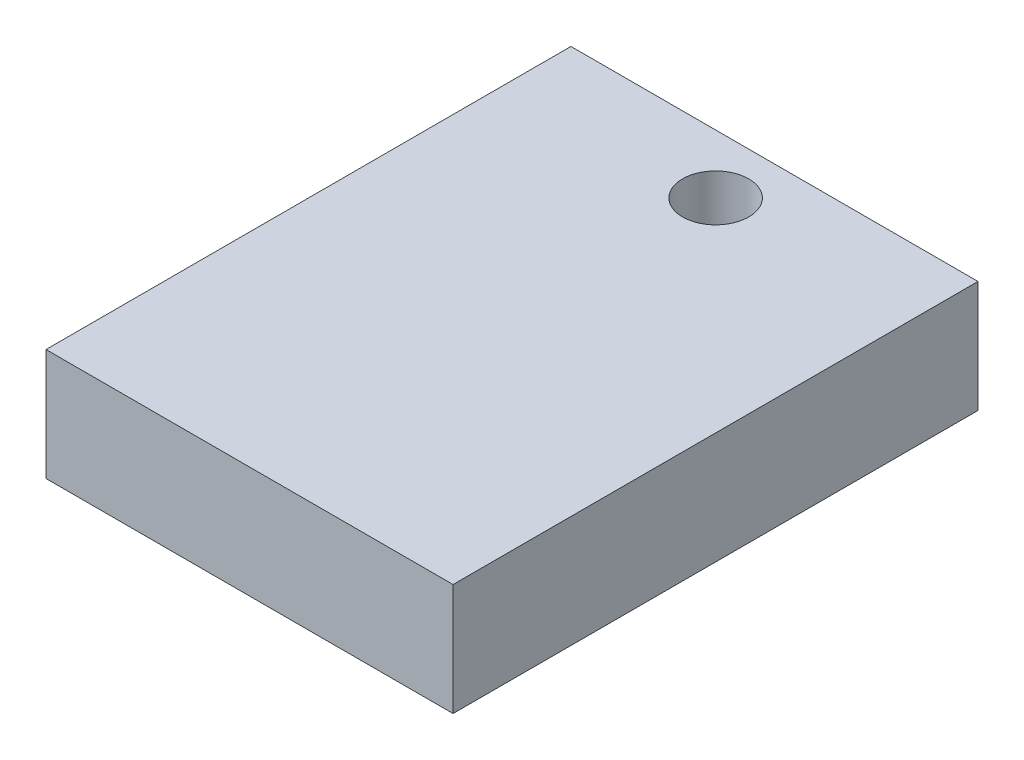
ISO-10303-21;
HEADER;
FILE_DESCRIPTION(('STEP AP214'),'2;1');
FILE_NAME('part.step','',(''),(''),'','','');
FILE_SCHEMA(('AUTOMOTIVE_DESIGN { 1 0 10303 214 1 1 1 1 }'));
ENDSEC;
DATA;
#1=APPLICATION_CONTEXT('core data for automotive mechanical design processes');
#2=APPLICATION_PROTOCOL_DEFINITION('international standard','automotive_design',2000,#1);
#3=PRODUCT_CONTEXT('',#1,'mechanical');
#4=PRODUCT('Part','Part','',(#3));
#5=PRODUCT_RELATED_PRODUCT_CATEGORY('part','',(#4));
#6=PRODUCT_DEFINITION_FORMATION('','',#4);
#7=PRODUCT_DEFINITION_CONTEXT('part definition',#1,'design');
#8=PRODUCT_DEFINITION('design','',#6,#7);
#9=PRODUCT_DEFINITION_SHAPE('','',#8);
#10=(LENGTH_UNIT() NAMED_UNIT(*) SI_UNIT(.MILLI.,.METRE.));
#11=(NAMED_UNIT(*) PLANE_ANGLE_UNIT() SI_UNIT($,.RADIAN.));
#12=(NAMED_UNIT(*) SI_UNIT($,.STERADIAN.) SOLID_ANGLE_UNIT());
#13=UNCERTAINTY_MEASURE_WITH_UNIT(LENGTH_MEASURE(1.E-05),#10,'distance_accuracy_value','');
#14=(GEOMETRIC_REPRESENTATION_CONTEXT(3) GLOBAL_UNCERTAINTY_ASSIGNED_CONTEXT((#13)) GLOBAL_UNIT_ASSIGNED_CONTEXT((#10,
#11,#12)) REPRESENTATION_CONTEXT('',''));
#15=CARTESIAN_POINT('',(0.,0.,0.));
#16=DIRECTION('',(0.,0.,1.));
#17=DIRECTION('',(1.,0.,0.));
#18=AXIS2_PLACEMENT_3D('',#15,#16,#17);
#19=CARTESIAN_POINT('',(0.,12.065,0.));
#20=DIRECTION('',(0.,1.,0.));
#21=DIRECTION('',(0.,0.,1.));
#22=AXIS2_PLACEMENT_3D('',#19,#20,#21);
#23=PLANE('',#22);
#24=DIRECTION('',(0.,0.,1.));
#25=VECTOR('',#24,1.);
#26=CARTESIAN_POINT('',(0.,12.065,0.));
#27=LINE('',#26,#25);
#28=CARTESIAN_POINT('',(0.,12.065,0.));
#29=VERTEX_POINT('',#28);
#30=CARTESIAN_POINT('',(0.,12.065,56.6674));
#31=VERTEX_POINT('',#30);
#32=EDGE_CURVE('E93',#29,#31,#27,.T.);
#33=ORIENTED_EDGE('',*,*,#32,.T.);
#34=DIRECTION('',(1.,0.,0.));
#35=VECTOR('',#34,1.);
#36=CARTESIAN_POINT('',(0.,12.065,56.6674));
#37=LINE('',#36,#35);
#38=CARTESIAN_POINT('',(43.942,12.065,56.6674));
#39=VERTEX_POINT('',#38);
#40=EDGE_CURVE('E88',#31,#39,#37,.T.);
#41=ORIENTED_EDGE('',*,*,#40,.T.);
#42=DIRECTION('',(0.,0.,-1.));
#43=VECTOR('',#42,1.);
#44=CARTESIAN_POINT('',(43.942,12.065,0.));
#45=LINE('',#44,#43);
#46=CARTESIAN_POINT('',(43.942,12.065,0.));
#47=VERTEX_POINT('',#46);
#48=EDGE_CURVE('E91',#39,#47,#45,.T.);
#49=ORIENTED_EDGE('',*,*,#48,.T.);
#50=DIRECTION('',(-1.,0.,0.));
#51=VECTOR('',#50,1.);
#52=CARTESIAN_POINT('',(0.,12.065,0.));
#53=LINE('',#52,#51);
#54=EDGE_CURVE('E58',#47,#29,#53,.T.);
#55=ORIENTED_EDGE('',*,*,#54,.T.);
#56=EDGE_LOOP('',(#33,#41,#49,#55));
#57=FACE_BOUND('',#56,.T.);
#58=CARTESIAN_POINT('',(21.971,12.065,6.35));
#59=DIRECTION('',(0.,1.,0.));
#60=DIRECTION('',(0.,0.,1.));
#61=AXIS2_PLACEMENT_3D('',#58,#59,#60);
#62=CIRCLE('',#61,3.57);
#63=CARTESIAN_POINT('',(21.971,12.065,2.78));
#64=VERTEX_POINT('',#63);
#65=EDGE_CURVE('E108',#64,#64,#62,.T.);
#66=ORIENTED_EDGE('',*,*,#65,.F.);
#67=EDGE_LOOP('',(#66));
#68=FACE_BOUND('',#67,.T.);
#69=ADVANCED_FACE('F41',(#57,#68),#23,.T.);
#70=CARTESIAN_POINT('',(0.,0.,0.));
#71=DIRECTION('',(0.,1.,0.));
#72=DIRECTION('',(0.,0.,1.));
#73=AXIS2_PLACEMENT_3D('',#70,#71,#72);
#74=PLANE('',#73);
#75=DIRECTION('',(0.,0.,1.));
#76=VECTOR('',#75,1.);
#77=CARTESIAN_POINT('',(0.,0.,0.));
#78=LINE('',#77,#76);
#79=CARTESIAN_POINT('',(0.,0.,0.));
#80=VERTEX_POINT('',#79);
#81=CARTESIAN_POINT('',(0.,0.,56.6674));
#82=VERTEX_POINT('',#81);
#83=EDGE_CURVE('E105',#80,#82,#78,.T.);
#84=ORIENTED_EDGE('',*,*,#83,.F.);
#85=DIRECTION('',(-1.,0.,0.));
#86=VECTOR('',#85,1.);
#87=CARTESIAN_POINT('',(0.,0.,0.));
#88=LINE('',#87,#86);
#89=CARTESIAN_POINT('',(43.942,0.,0.));
#90=VERTEX_POINT('',#89);
#91=EDGE_CURVE('E81',#90,#80,#88,.T.);
#92=ORIENTED_EDGE('',*,*,#91,.F.);
#93=DIRECTION('',(0.,0.,-1.));
#94=VECTOR('',#93,1.);
#95=CARTESIAN_POINT('',(43.942,0.,0.));
#96=LINE('',#95,#94);
#97=CARTESIAN_POINT('',(43.942,0.,56.6674));
#98=VERTEX_POINT('',#97);
#99=EDGE_CURVE('E75',#98,#90,#96,.T.);
#100=ORIENTED_EDGE('',*,*,#99,.F.);
#101=DIRECTION('',(1.,0.,0.));
#102=VECTOR('',#101,1.);
#103=CARTESIAN_POINT('',(0.,0.,56.6674));
#104=LINE('',#103,#102);
#105=EDGE_CURVE('E97',#82,#98,#104,.T.);
#106=ORIENTED_EDGE('',*,*,#105,.F.);
#107=EDGE_LOOP('',(#84,#92,#100,#106));
#108=FACE_BOUND('',#107,.T.);
#109=CARTESIAN_POINT('',(21.971,0.,6.35));
#110=DIRECTION('',(0.,1.,0.));
#111=DIRECTION('',(0.,0.,1.));
#112=AXIS2_PLACEMENT_3D('',#109,#110,#111);
#113=CIRCLE('',#112,3.57);
#114=CARTESIAN_POINT('',(21.971,0.,2.78));
#115=VERTEX_POINT('',#114);
#116=EDGE_CURVE('E120',#115,#115,#113,.T.);
#117=ORIENTED_EDGE('',*,*,#116,.T.);
#118=EDGE_LOOP('',(#117));
#119=FACE_BOUND('',#118,.T.);
#120=ADVANCED_FACE('F116',(#108,#119),#74,.F.);
#121=CARTESIAN_POINT('',(0.,12.065,0.));
#122=DIRECTION('',(1.,0.,0.));
#123=DIRECTION('',(0.,0.,-1.));
#124=AXIS2_PLACEMENT_3D('',#121,#122,#123);
#125=PLANE('',#124);
#126=ORIENTED_EDGE('',*,*,#83,.T.);
#127=DIRECTION('',(0.,-1.,0.));
#128=VECTOR('',#127,1.);
#129=CARTESIAN_POINT('',(0.,12.065,56.6674));
#130=LINE('',#129,#128);
#131=EDGE_CURVE('E11',#31,#82,#130,.T.);
#132=ORIENTED_EDGE('',*,*,#131,.F.);
#133=ORIENTED_EDGE('',*,*,#32,.F.);
#134=DIRECTION('',(0.,-1.,0.));
#135=VECTOR('',#134,1.);
#136=CARTESIAN_POINT('',(0.,12.065,0.));
#137=LINE('',#136,#135);
#138=EDGE_CURVE('E101',#29,#80,#137,.T.);
#139=ORIENTED_EDGE('',*,*,#138,.T.);
#140=EDGE_LOOP('',(#126,#132,#133,#139));
#141=FACE_BOUND('',#140,.T.);
#142=ADVANCED_FACE('F43',(#141),#125,.F.);
#143=CARTESIAN_POINT('',(0.,12.065,56.6674));
#144=DIRECTION('',(0.,0.,-1.));
#145=DIRECTION('',(-1.,0.,0.));
#146=AXIS2_PLACEMENT_3D('',#143,#144,#145);
#147=PLANE('',#146);
#148=ORIENTED_EDGE('',*,*,#105,.T.);
#149=DIRECTION('',(0.,-1.,0.));
#150=VECTOR('',#149,1.);
#151=CARTESIAN_POINT('',(43.942,12.065,56.6674));
#152=LINE('',#151,#150);
#153=EDGE_CURVE('E50',#39,#98,#152,.T.);
#154=ORIENTED_EDGE('',*,*,#153,.F.);
#155=ORIENTED_EDGE('',*,*,#40,.F.);
#156=ORIENTED_EDGE('',*,*,#131,.T.);
#157=EDGE_LOOP('',(#148,#154,#155,#156));
#158=FACE_BOUND('',#157,.T.);
#159=ADVANCED_FACE('F96',(#158),#147,.F.);
#160=CARTESIAN_POINT('',(43.942,12.065,0.));
#161=DIRECTION('',(-1.,0.,0.));
#162=DIRECTION('',(0.,0.,1.));
#163=AXIS2_PLACEMENT_3D('',#160,#161,#162);
#164=PLANE('',#163);
#165=ORIENTED_EDGE('',*,*,#99,.T.);
#166=DIRECTION('',(0.,-1.,0.));
#167=VECTOR('',#166,1.);
#168=CARTESIAN_POINT('',(43.942,12.065,0.));
#169=LINE('',#168,#167);
#170=EDGE_CURVE('E98',#47,#90,#169,.T.);
#171=ORIENTED_EDGE('',*,*,#170,.F.);
#172=ORIENTED_EDGE('',*,*,#48,.F.);
#173=ORIENTED_EDGE('',*,*,#153,.T.);
#174=EDGE_LOOP('',(#165,#171,#172,#173));
#175=FACE_BOUND('',#174,.T.);
#176=ADVANCED_FACE('F99',(#175),#164,.F.);
#177=CARTESIAN_POINT('',(0.,12.065,0.));
#178=DIRECTION('',(0.,0.,1.));
#179=DIRECTION('',(1.,0.,0.));
#180=AXIS2_PLACEMENT_3D('',#177,#178,#179);
#181=PLANE('',#180);
#182=ORIENTED_EDGE('',*,*,#91,.T.);
#183=ORIENTED_EDGE('',*,*,#138,.F.);
#184=ORIENTED_EDGE('',*,*,#54,.F.);
#185=ORIENTED_EDGE('',*,*,#170,.T.);
#186=EDGE_LOOP('',(#182,#183,#184,#185));
#187=FACE_BOUND('',#186,.T.);
#188=ADVANCED_FACE('F113',(#187),#181,.F.);
#189=CARTESIAN_POINT('',(21.971,12.065,6.35));
#190=DIRECTION('',(0.,-1.,0.));
#191=DIRECTION('',(0.,0.,-1.));
#192=AXIS2_PLACEMENT_3D('',#189,#190,#191);
#193=CYLINDRICAL_SURFACE('',#192,3.57);
#194=CARTESIAN_POINT('',(21.971,12.065,2.78));
#195=CARTESIAN_POINT('',(21.971,11.9393229166667,2.78));
#196=CARTESIAN_POINT('',(21.971,11.8136458333333,2.78));
#197=CARTESIAN_POINT('',(21.971,11.5622916666667,2.78));
#198=CARTESIAN_POINT('',(21.971,11.4366145833333,2.78));
#199=CARTESIAN_POINT('',(21.971,11.1852604166667,2.78));
#200=CARTESIAN_POINT('',(21.971,11.0595833333333,2.78));
#201=CARTESIAN_POINT('',(21.971,10.8082291666667,2.78));
#202=CARTESIAN_POINT('',(21.971,10.6825520833333,2.78));
#203=CARTESIAN_POINT('',(21.971,10.4311979166667,2.78));
#204=CARTESIAN_POINT('',(21.971,10.3055208333333,2.78));
#205=CARTESIAN_POINT('',(21.971,10.0541666666667,2.78));
#206=CARTESIAN_POINT('',(21.971,9.92848958333333,2.78));
#207=CARTESIAN_POINT('',(21.971,9.67713541666667,2.78));
#208=CARTESIAN_POINT('',(21.971,9.55145833333333,2.78));
#209=CARTESIAN_POINT('',(21.971,9.30010416666667,2.78));
#210=CARTESIAN_POINT('',(21.971,9.17442708333333,2.78));
#211=CARTESIAN_POINT('',(21.971,8.92307291666667,2.78));
#212=CARTESIAN_POINT('',(21.971,8.79739583333333,2.78));
#213=CARTESIAN_POINT('',(21.971,8.54604166666667,2.78));
#214=CARTESIAN_POINT('',(21.971,8.42036458333333,2.78));
#215=CARTESIAN_POINT('',(21.971,8.16901041666667,2.78));
#216=CARTESIAN_POINT('',(21.971,8.04333333333333,2.78));
#217=CARTESIAN_POINT('',(21.971,7.79197916666666,2.78));
#218=CARTESIAN_POINT('',(21.971,7.66630208333333,2.78));
#219=CARTESIAN_POINT('',(21.971,7.41494791666666,2.78));
#220=CARTESIAN_POINT('',(21.971,7.28927083333333,2.78));
#221=CARTESIAN_POINT('',(21.971,7.03791666666667,2.78));
#222=CARTESIAN_POINT('',(21.971,6.91223958333333,2.78));
#223=CARTESIAN_POINT('',(21.971,6.66088541666667,2.78));
#224=CARTESIAN_POINT('',(21.971,6.53520833333333,2.78));
#225=CARTESIAN_POINT('',(21.971,6.28385416666667,2.78));
#226=CARTESIAN_POINT('',(21.971,6.15817708333333,2.78));
#227=CARTESIAN_POINT('',(21.971,5.90682291666667,2.78));
#228=CARTESIAN_POINT('',(21.971,5.78114583333333,2.78));
#229=CARTESIAN_POINT('',(21.971,5.52979166666667,2.78));
#230=CARTESIAN_POINT('',(21.971,5.40411458333333,2.78));
#231=CARTESIAN_POINT('',(21.971,5.15276041666666,2.78));
#232=CARTESIAN_POINT('',(21.971,5.02708333333333,2.78));
#233=CARTESIAN_POINT('',(21.971,4.77572916666667,2.78));
#234=CARTESIAN_POINT('',(21.971,4.65005208333333,2.78));
#235=CARTESIAN_POINT('',(21.971,4.39869791666667,2.78));
#236=CARTESIAN_POINT('',(21.971,4.27302083333333,2.78));
#237=CARTESIAN_POINT('',(21.971,4.02166666666667,2.78));
#238=CARTESIAN_POINT('',(21.971,3.89598958333333,2.78));
#239=CARTESIAN_POINT('',(21.971,3.64463541666667,2.78));
#240=CARTESIAN_POINT('',(21.971,3.51895833333333,2.78));
#241=CARTESIAN_POINT('',(21.971,3.26760416666666,2.78));
#242=CARTESIAN_POINT('',(21.971,3.14192708333333,2.78));
#243=CARTESIAN_POINT('',(21.971,2.89057291666666,2.78));
#244=CARTESIAN_POINT('',(21.971,2.76489583333333,2.78));
#245=CARTESIAN_POINT('',(21.971,2.51354166666667,2.78));
#246=CARTESIAN_POINT('',(21.971,2.38786458333333,2.78));
#247=CARTESIAN_POINT('',(21.971,2.13651041666667,2.78));
#248=CARTESIAN_POINT('',(21.971,2.01083333333333,2.78));
#249=CARTESIAN_POINT('',(21.971,1.75947916666667,2.78));
#250=CARTESIAN_POINT('',(21.971,1.63380208333333,2.78));
#251=CARTESIAN_POINT('',(21.971,1.38244791666667,2.78));
#252=CARTESIAN_POINT('',(21.971,1.25677083333333,2.78));
#253=CARTESIAN_POINT('',(21.971,1.00541666666666,2.78));
#254=CARTESIAN_POINT('',(21.971,0.879739583333331,2.78));
#255=CARTESIAN_POINT('',(21.971,0.628385416666665,2.78));
#256=CARTESIAN_POINT('',(21.971,0.502708333333331,2.78));
#257=CARTESIAN_POINT('',(21.971,0.251354166666665,2.78));
#258=CARTESIAN_POINT('',(21.971,0.125677083333331,2.78));
#259=CARTESIAN_POINT('',(21.971,0.,2.78));
#260=B_SPLINE_CURVE_WITH_KNOTS('',3,(#194,#195,#196,#197,#198,#199,#200,#201,#202,#203,#204,
#205,#206,#207,#208,#209,#210,#211,#212,#213,#214,#215,#216,#217,#218,#219,#220,#221,#222,#223,
#224,#225,#226,#227,#228,#229,#230,#231,#232,#233,#234,#235,#236,#237,#238,#239,#240,#241,#242,
#243,#244,#245,#246,#247,#248,#249,#250,#251,#252,#253,#254,#255,#256,#257,#258,#259),
.UNSPECIFIED.,.F.,.F.,(4,2,2,2,2,2,2,2,2,2,2,2,2,2,2,2,2,2,2,2,2,2,2,2,2,2,2,2,2,2,2,2,4),(0.,
0.37703125,0.7540625,1.13109375,1.508125,1.88515625,2.2621875,2.63921875,3.01625,3.39328125,
3.7703125,4.14734375,4.524375,4.90140625,5.2784375,5.65546875,6.0325,6.40953125,6.7865625,
7.16359375,7.540625,7.91765625,8.2946875,8.67171875,9.04875,9.42578125,9.8028125,10.17984375,
10.556875,10.93390625,11.3109375,11.68796875,12.065),.UNSPECIFIED.);
#261=EDGE_CURVE('BSEAM126',#64,#115,#260,.T.);
#262=ORIENTED_EDGE('',*,*,#65,.T.);
#263=ORIENTED_EDGE('',*,*,#116,.F.);
#264=ORIENTED_EDGE('',*,*,#261,.T.);
#265=ORIENTED_EDGE('',*,*,#261,.F.);
#266=EDGE_LOOP('',(#262,#264,#263,#265));
#267=FACE_BOUND('',#266,.T.);
#268=ADVANCED_FACE('F126',(#267),#193,.F.);
#269=CLOSED_SHELL('',(#69,#120,#142,#159,#176,#188,#268));
#270=MANIFOLD_SOLID_BREP('B2',#269);
#271=ADVANCED_BREP_SHAPE_REPRESENTATION('',(#18,#270),#14);
#272=SHAPE_DEFINITION_REPRESENTATION(#9,#271);
ENDSEC;
END-ISO-10303-21;
